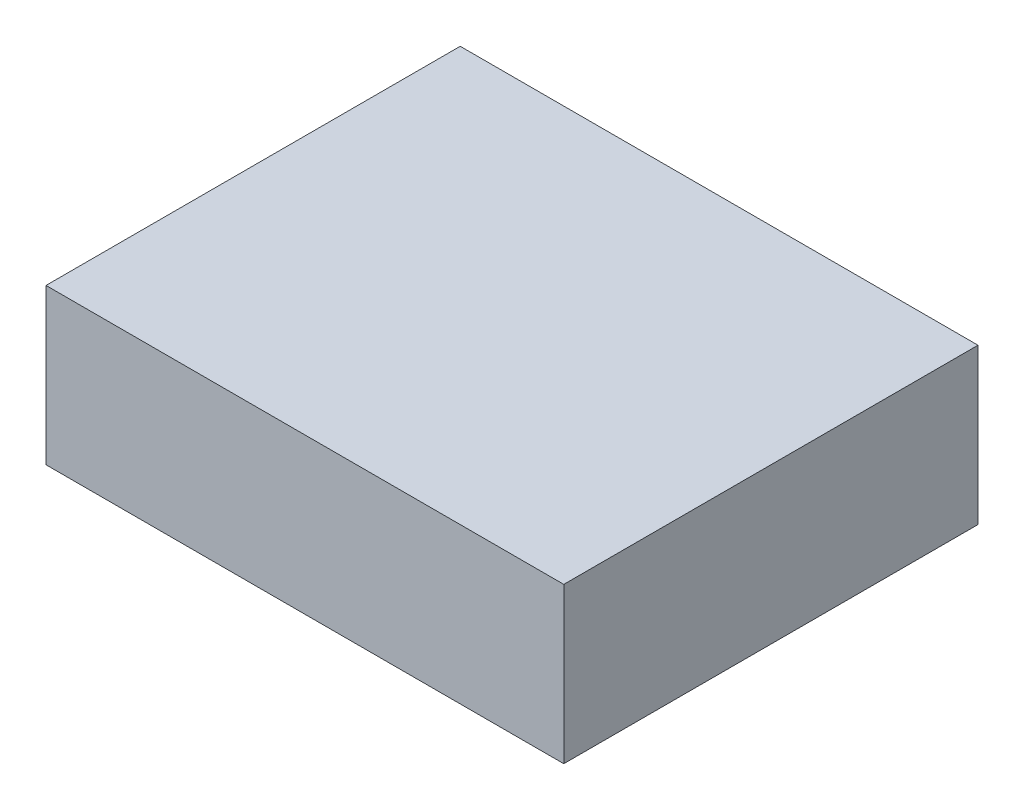
ISO-10303-21;
HEADER;
FILE_DESCRIPTION(('STEP AP214'),'2;1');
FILE_NAME('part.step','',(''),(''),'','','');
FILE_SCHEMA(('AUTOMOTIVE_DESIGN { 1 0 10303 214 1 1 1 1 }'));
ENDSEC;
DATA;
#1=APPLICATION_CONTEXT('core data for automotive mechanical design processes');
#2=APPLICATION_PROTOCOL_DEFINITION('international standard','automotive_design',2000,#1);
#3=PRODUCT_CONTEXT('',#1,'mechanical');
#4=PRODUCT('Part','Part','',(#3));
#5=PRODUCT_RELATED_PRODUCT_CATEGORY('part','',(#4));
#6=PRODUCT_DEFINITION_FORMATION('','',#4);
#7=PRODUCT_DEFINITION_CONTEXT('part definition',#1,'design');
#8=PRODUCT_DEFINITION('design','',#6,#7);
#9=PRODUCT_DEFINITION_SHAPE('','',#8);
#10=(LENGTH_UNIT() NAMED_UNIT(*) SI_UNIT(.MILLI.,.METRE.));
#11=(NAMED_UNIT(*) PLANE_ANGLE_UNIT() SI_UNIT($,.RADIAN.));
#12=(NAMED_UNIT(*) SI_UNIT($,.STERADIAN.) SOLID_ANGLE_UNIT());
#13=UNCERTAINTY_MEASURE_WITH_UNIT(LENGTH_MEASURE(1.E-05),#10,'distance_accuracy_value','');
#14=(GEOMETRIC_REPRESENTATION_CONTEXT(3) GLOBAL_UNCERTAINTY_ASSIGNED_CONTEXT((#13)) GLOBAL_UNIT_ASSIGNED_CONTEXT((#10,
#11,#12)) REPRESENTATION_CONTEXT('',''));
#15=CARTESIAN_POINT('',(0.,0.,0.));
#16=DIRECTION('',(0.,0.,1.));
#17=DIRECTION('',(1.,0.,0.));
#18=AXIS2_PLACEMENT_3D('',#15,#16,#17);
#19=CARTESIAN_POINT('',(-50.,30.,-40.));
#20=DIRECTION('',(1.,0.,0.));
#21=DIRECTION('',(0.,0.,-1.));
#22=AXIS2_PLACEMENT_3D('',#19,#20,#21);
#23=PLANE('',#22);
#24=DIRECTION('',(0.,0.,1.));
#25=VECTOR('',#24,1.);
#26=CARTESIAN_POINT('',(-50.,0.,-40.));
#27=LINE('',#26,#25);
#28=CARTESIAN_POINT('',(-50.,0.,-40.));
#29=VERTEX_POINT('',#28);
#30=CARTESIAN_POINT('',(-50.,0.,40.));
#31=VERTEX_POINT('',#30);
#32=EDGE_CURVE('E106',#29,#31,#27,.T.);
#33=ORIENTED_EDGE('',*,*,#32,.T.);
#34=DIRECTION('',(0.,-1.,0.));
#35=VECTOR('',#34,1.);
#36=CARTESIAN_POINT('',(-50.,30.,40.));
#37=LINE('',#36,#35);
#38=CARTESIAN_POINT('',(-50.,30.,40.));
#39=VERTEX_POINT('',#38);
#40=EDGE_CURVE('E11',#39,#31,#37,.T.);
#41=ORIENTED_EDGE('',*,*,#40,.F.);
#42=DIRECTION('',(0.,0.,1.));
#43=VECTOR('',#42,1.);
#44=CARTESIAN_POINT('',(-50.,30.,-40.));
#45=LINE('',#44,#43);
#46=CARTESIAN_POINT('',(-50.,30.,-40.));
#47=VERTEX_POINT('',#46);
#48=EDGE_CURVE('E94',#47,#39,#45,.T.);
#49=ORIENTED_EDGE('',*,*,#48,.F.);
#50=DIRECTION('',(0.,-1.,0.));
#51=VECTOR('',#50,1.);
#52=CARTESIAN_POINT('',(-50.,30.,-40.));
#53=LINE('',#52,#51);
#54=EDGE_CURVE('E102',#47,#29,#53,.T.);
#55=ORIENTED_EDGE('',*,*,#54,.T.);
#56=EDGE_LOOP('',(#33,#41,#49,#55));
#57=FACE_BOUND('',#56,.T.);
#58=ADVANCED_FACE('F43',(#57),#23,.F.);
#59=CARTESIAN_POINT('',(-50.,30.,40.));
#60=DIRECTION('',(0.,0.,-1.));
#61=DIRECTION('',(-1.,0.,0.));
#62=AXIS2_PLACEMENT_3D('',#59,#60,#61);
#63=PLANE('',#62);
#64=DIRECTION('',(1.,0.,0.));
#65=VECTOR('',#64,1.);
#66=CARTESIAN_POINT('',(-50.,0.,40.));
#67=LINE('',#66,#65);
#68=CARTESIAN_POINT('',(50.,0.,40.));
#69=VERTEX_POINT('',#68);
#70=EDGE_CURVE('E98',#31,#69,#67,.T.);
#71=ORIENTED_EDGE('',*,*,#70,.T.);
#72=DIRECTION('',(0.,-1.,0.));
#73=VECTOR('',#72,1.);
#74=CARTESIAN_POINT('',(50.,30.,40.));
#75=LINE('',#74,#73);
#76=CARTESIAN_POINT('',(50.,30.,40.));
#77=VERTEX_POINT('',#76);
#78=EDGE_CURVE('E51',#77,#69,#75,.T.);
#79=ORIENTED_EDGE('',*,*,#78,.F.);
#80=DIRECTION('',(1.,0.,0.));
#81=VECTOR('',#80,1.);
#82=CARTESIAN_POINT('',(-50.,30.,40.));
#83=LINE('',#82,#81);
#84=EDGE_CURVE('E89',#39,#77,#83,.T.);
#85=ORIENTED_EDGE('',*,*,#84,.F.);
#86=ORIENTED_EDGE('',*,*,#40,.T.);
#87=EDGE_LOOP('',(#71,#79,#85,#86));
#88=FACE_BOUND('',#87,.T.);
#89=ADVANCED_FACE('F97',(#88),#63,.F.);
#90=CARTESIAN_POINT('',(50.,30.,-40.));
#91=DIRECTION('',(-1.,0.,0.));
#92=DIRECTION('',(0.,0.,1.));
#93=AXIS2_PLACEMENT_3D('',#90,#91,#92);
#94=PLANE('',#93);
#95=DIRECTION('',(0.,0.,-1.));
#96=VECTOR('',#95,1.);
#97=CARTESIAN_POINT('',(50.,0.,-40.));
#98=LINE('',#97,#96);
#99=CARTESIAN_POINT('',(50.,0.,-40.));
#100=VERTEX_POINT('',#99);
#101=EDGE_CURVE('E76',#69,#100,#98,.T.);
#102=ORIENTED_EDGE('',*,*,#101,.T.);
#103=DIRECTION('',(0.,-1.,0.));
#104=VECTOR('',#103,1.);
#105=CARTESIAN_POINT('',(50.,30.,-40.));
#106=LINE('',#105,#104);
#107=CARTESIAN_POINT('',(50.,30.,-40.));
#108=VERTEX_POINT('',#107);
#109=EDGE_CURVE('E99',#108,#100,#106,.T.);
#110=ORIENTED_EDGE('',*,*,#109,.F.);
#111=DIRECTION('',(0.,0.,-1.));
#112=VECTOR('',#111,1.);
#113=CARTESIAN_POINT('',(50.,30.,-40.));
#114=LINE('',#113,#112);
#115=EDGE_CURVE('E92',#77,#108,#114,.T.);
#116=ORIENTED_EDGE('',*,*,#115,.F.);
#117=ORIENTED_EDGE('',*,*,#78,.T.);
#118=EDGE_LOOP('',(#102,#110,#116,#117));
#119=FACE_BOUND('',#118,.T.);
#120=ADVANCED_FACE('F100',(#119),#94,.F.);
#121=CARTESIAN_POINT('',(-50.,30.,-40.));
#122=DIRECTION('',(0.,0.,1.));
#123=DIRECTION('',(1.,0.,0.));
#124=AXIS2_PLACEMENT_3D('',#121,#122,#123);
#125=PLANE('',#124);
#126=DIRECTION('',(-1.,0.,0.));
#127=VECTOR('',#126,1.);
#128=CARTESIAN_POINT('',(-50.,0.,-40.));
#129=LINE('',#128,#127);
#130=EDGE_CURVE('E82',#100,#29,#129,.T.);
#131=ORIENTED_EDGE('',*,*,#130,.T.);
#132=ORIENTED_EDGE('',*,*,#54,.F.);
#133=DIRECTION('',(-1.,0.,0.));
#134=VECTOR('',#133,1.);
#135=CARTESIAN_POINT('',(-50.,30.,-40.));
#136=LINE('',#135,#134);
#137=EDGE_CURVE('E59',#108,#47,#136,.T.);
#138=ORIENTED_EDGE('',*,*,#137,.F.);
#139=ORIENTED_EDGE('',*,*,#109,.T.);
#140=EDGE_LOOP('',(#131,#132,#138,#139));
#141=FACE_BOUND('',#140,.T.);
#142=ADVANCED_FACE('F113',(#141),#125,.F.);
#143=CARTESIAN_POINT('',(0.,30.,0.));
#144=DIRECTION('',(0.,1.,0.));
#145=DIRECTION('',(0.,0.,1.));
#146=AXIS2_PLACEMENT_3D('',#143,#144,#145);
#147=PLANE('',#146);
#148=ORIENTED_EDGE('',*,*,#48,.T.);
#149=ORIENTED_EDGE('',*,*,#84,.T.);
#150=ORIENTED_EDGE('',*,*,#115,.T.);
#151=ORIENTED_EDGE('',*,*,#137,.T.);
#152=EDGE_LOOP('',(#148,#149,#150,#151));
#153=FACE_BOUND('',#152,.T.);
#154=ADVANCED_FACE('F90',(#153),#147,.T.);
#155=CARTESIAN_POINT('',(0.,0.,0.));
#156=DIRECTION('',(0.,1.,0.));
#157=DIRECTION('',(0.,0.,1.));
#158=AXIS2_PLACEMENT_3D('',#155,#156,#157);
#159=PLANE('',#158);
#160=ORIENTED_EDGE('',*,*,#32,.F.);
#161=ORIENTED_EDGE('',*,*,#130,.F.);
#162=ORIENTED_EDGE('',*,*,#101,.F.);
#163=ORIENTED_EDGE('',*,*,#70,.F.);
#164=EDGE_LOOP('',(#160,#161,#162,#163));
#165=FACE_BOUND('',#164,.T.);
#166=ADVANCED_FACE('F116',(#165),#159,.F.);
#167=CLOSED_SHELL('',(#58,#89,#120,#142,#154,#166));
#168=MANIFOLD_SOLID_BREP('B2',#167);
#169=ADVANCED_BREP_SHAPE_REPRESENTATION('',(#18,#168),#14);
#170=SHAPE_DEFINITION_REPRESENTATION(#9,#169);
ENDSEC;
END-ISO-10303-21;
